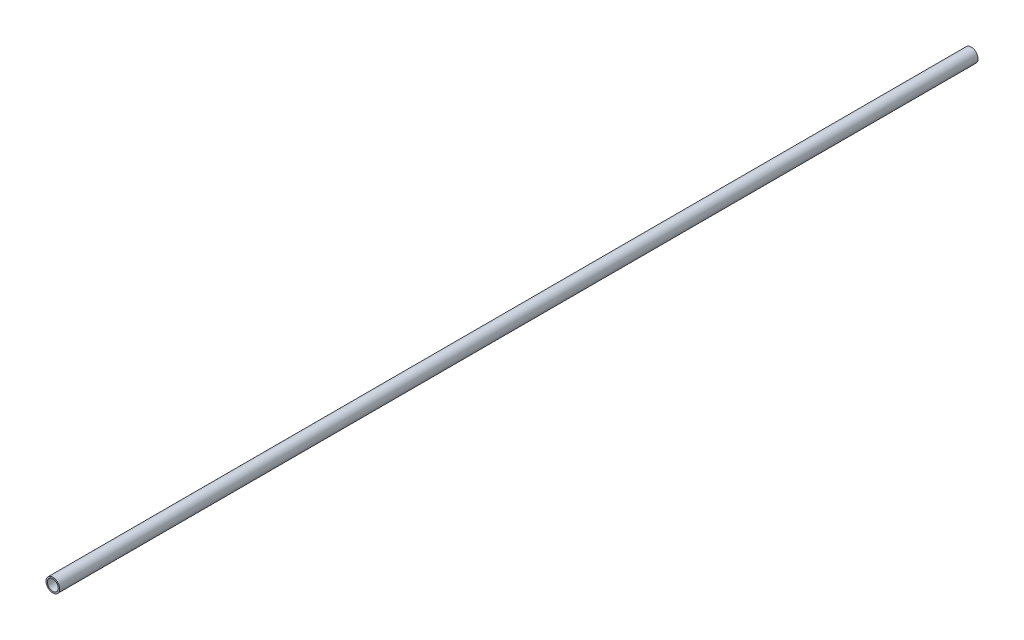
ISO-10303-21;
HEADER;
FILE_DESCRIPTION(('STEP AP214'),'2;1');
FILE_NAME('part.step','',(''),(''),'','','');
FILE_SCHEMA(('AUTOMOTIVE_DESIGN { 1 0 10303 214 1 1 1 1 }'));
ENDSEC;
DATA;
#1=APPLICATION_CONTEXT('core data for automotive mechanical design processes');
#2=APPLICATION_PROTOCOL_DEFINITION('international standard','automotive_design',2000,#1);
#3=PRODUCT_CONTEXT('',#1,'mechanical');
#4=PRODUCT('Part','Part','',(#3));
#5=PRODUCT_RELATED_PRODUCT_CATEGORY('part','',(#4));
#6=PRODUCT_DEFINITION_FORMATION('','',#4);
#7=PRODUCT_DEFINITION_CONTEXT('part definition',#1,'design');
#8=PRODUCT_DEFINITION('design','',#6,#7);
#9=PRODUCT_DEFINITION_SHAPE('','',#8);
#10=(LENGTH_UNIT() NAMED_UNIT(*) SI_UNIT(.MILLI.,.METRE.));
#11=(NAMED_UNIT(*) PLANE_ANGLE_UNIT() SI_UNIT($,.RADIAN.));
#12=(NAMED_UNIT(*) SI_UNIT($,.STERADIAN.) SOLID_ANGLE_UNIT());
#13=UNCERTAINTY_MEASURE_WITH_UNIT(LENGTH_MEASURE(1.E-05),#10,'distance_accuracy_value','');
#14=(GEOMETRIC_REPRESENTATION_CONTEXT(3) GLOBAL_UNCERTAINTY_ASSIGNED_CONTEXT((#13)) GLOBAL_UNIT_ASSIGNED_CONTEXT((#10,
#11,#12)) REPRESENTATION_CONTEXT('',''));
#15=CARTESIAN_POINT('',(0.,0.,0.));
#16=DIRECTION('',(0.,0.,1.));
#17=DIRECTION('',(1.,0.,0.));
#18=AXIS2_PLACEMENT_3D('',#15,#16,#17);
#19=CARTESIAN_POINT('',(0.,0.,673.));
#20=DIRECTION('',(0.,0.,1.));
#21=DIRECTION('',(1.,0.,0.));
#22=AXIS2_PLACEMENT_3D('',#19,#20,#21);
#23=PLANE('',#22);
#24=CARTESIAN_POINT('',(0.,0.,673.));
#25=DIRECTION('',(0.,0.,1.));
#26=DIRECTION('',(1.,0.,0.));
#27=AXIS2_PLACEMENT_3D('',#24,#25,#26);
#28=CIRCLE('',#27,5.);
#29=CARTESIAN_POINT('',(5.,0.,673.));
#30=VERTEX_POINT('',#29);
#31=EDGE_CURVE('E10',#30,#30,#28,.T.);
#32=ORIENTED_EDGE('',*,*,#31,.T.);
#33=EDGE_LOOP('',(#32));
#34=FACE_BOUND('',#33,.T.);
#35=CARTESIAN_POINT('',(0.,0.,673.));
#36=DIRECTION('',(0.,0.,1.));
#37=DIRECTION('',(1.,0.,0.));
#38=AXIS2_PLACEMENT_3D('',#35,#36,#37);
#39=CIRCLE('',#38,4.);
#40=CARTESIAN_POINT('',(4.,0.,673.));
#41=VERTEX_POINT('',#40);
#42=EDGE_CURVE('E56',#41,#41,#39,.T.);
#43=ORIENTED_EDGE('',*,*,#42,.F.);
#44=EDGE_LOOP('',(#43));
#45=FACE_BOUND('',#44,.T.);
#46=ADVANCED_FACE('F43',(#34,#45),#23,.T.);
#47=CARTESIAN_POINT('',(0.,0.,0.));
#48=DIRECTION('',(0.,0.,1.));
#49=DIRECTION('',(1.,0.,0.));
#50=AXIS2_PLACEMENT_3D('',#47,#48,#49);
#51=PLANE('',#50);
#52=CARTESIAN_POINT('',(0.,0.,0.));
#53=DIRECTION('',(0.,0.,1.));
#54=DIRECTION('',(1.,0.,0.));
#55=AXIS2_PLACEMENT_3D('',#52,#53,#54);
#56=CIRCLE('',#55,5.);
#57=CARTESIAN_POINT('',(5.,0.,0.));
#58=VERTEX_POINT('',#57);
#59=EDGE_CURVE('E47',#58,#58,#56,.T.);
#60=ORIENTED_EDGE('',*,*,#59,.F.);
#61=EDGE_LOOP('',(#60));
#62=FACE_BOUND('',#61,.T.);
#63=CARTESIAN_POINT('',(0.,0.,0.));
#64=DIRECTION('',(0.,0.,1.));
#65=DIRECTION('',(1.,0.,0.));
#66=AXIS2_PLACEMENT_3D('',#63,#64,#65);
#67=CIRCLE('',#66,4.);
#68=CARTESIAN_POINT('',(4.,0.,0.));
#69=VERTEX_POINT('',#68);
#70=EDGE_CURVE('E58',#69,#69,#67,.T.);
#71=ORIENTED_EDGE('',*,*,#70,.T.);
#72=EDGE_LOOP('',(#71));
#73=FACE_BOUND('',#72,.T.);
#74=ADVANCED_FACE('F70',(#62,#73),#51,.F.);
#75=CARTESIAN_POINT('',(0.,0.,673.));
#76=DIRECTION('',(0.,0.,-1.));
#77=DIRECTION('',(-1.,0.,0.));
#78=AXIS2_PLACEMENT_3D('',#75,#76,#77);
#79=CYLINDRICAL_SURFACE('',#78,5.);
#80=ORIENTED_EDGE('',*,*,#31,.F.);
#81=EDGE_LOOP('',(#80));
#82=FACE_BOUND('',#81,.T.);
#83=ORIENTED_EDGE('',*,*,#59,.T.);
#84=EDGE_LOOP('',(#83));
#85=FACE_BOUND('',#84,.T.);
#86=ADVANCED_FACE('F45',(#82,#85),#79,.T.);
#87=CARTESIAN_POINT('',(0.,0.,673.));
#88=DIRECTION('',(0.,0.,-1.));
#89=DIRECTION('',(-1.,0.,0.));
#90=AXIS2_PLACEMENT_3D('',#87,#88,#89);
#91=CYLINDRICAL_SURFACE('',#90,4.);
#92=ORIENTED_EDGE('',*,*,#42,.T.);
#93=EDGE_LOOP('',(#92));
#94=FACE_BOUND('',#93,.T.);
#95=ORIENTED_EDGE('',*,*,#70,.F.);
#96=EDGE_LOOP('',(#95));
#97=FACE_BOUND('',#96,.T.);
#98=ADVANCED_FACE('F66',(#94,#97),#91,.F.);
#99=CLOSED_SHELL('',(#46,#74,#86,#98));
#100=MANIFOLD_SOLID_BREP('B2',#99);
#101=ADVANCED_BREP_SHAPE_REPRESENTATION('',(#18,#100),#14);
#102=SHAPE_DEFINITION_REPRESENTATION(#9,#101);
ENDSEC;
END-ISO-10303-21;
